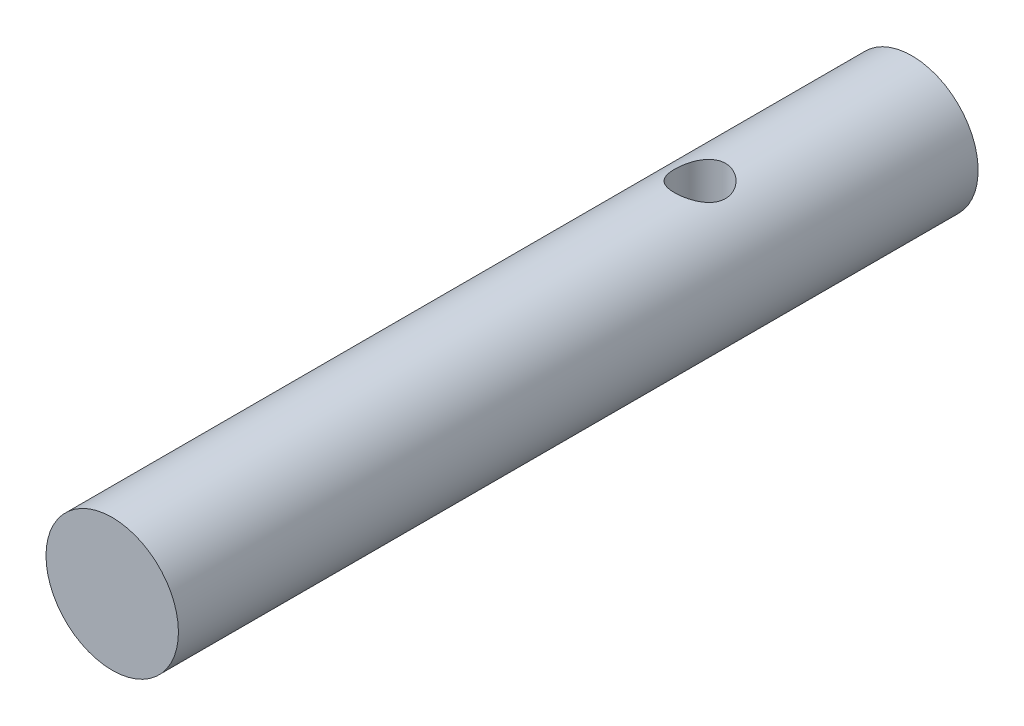
ISO-10303-21;
HEADER;
FILE_DESCRIPTION(('STEP AP214'),'2;1');
FILE_NAME('part.step','',(''),(''),'','','');
FILE_SCHEMA(('AUTOMOTIVE_DESIGN { 1 0 10303 214 1 1 1 1 }'));
ENDSEC;
DATA;
#1=APPLICATION_CONTEXT('core data for automotive mechanical design processes');
#2=APPLICATION_PROTOCOL_DEFINITION('international standard','automotive_design',2000,#1);
#3=PRODUCT_CONTEXT('',#1,'mechanical');
#4=PRODUCT('Part','Part','',(#3));
#5=PRODUCT_RELATED_PRODUCT_CATEGORY('part','',(#4));
#6=PRODUCT_DEFINITION_FORMATION('','',#4);
#7=PRODUCT_DEFINITION_CONTEXT('part definition',#1,'design');
#8=PRODUCT_DEFINITION('design','',#6,#7);
#9=PRODUCT_DEFINITION_SHAPE('','',#8);
#10=(LENGTH_UNIT() NAMED_UNIT(*) SI_UNIT(.MILLI.,.METRE.));
#11=(NAMED_UNIT(*) PLANE_ANGLE_UNIT() SI_UNIT($,.RADIAN.));
#12=(NAMED_UNIT(*) SI_UNIT($,.STERADIAN.) SOLID_ANGLE_UNIT());
#13=UNCERTAINTY_MEASURE_WITH_UNIT(LENGTH_MEASURE(1.E-05),#10,'distance_accuracy_value','');
#14=(GEOMETRIC_REPRESENTATION_CONTEXT(3) GLOBAL_UNCERTAINTY_ASSIGNED_CONTEXT((#13)) GLOBAL_UNIT_ASSIGNED_CONTEXT((#10,
#11,#12)) REPRESENTATION_CONTEXT('',''));
#15=CARTESIAN_POINT('',(0.,0.,0.));
#16=DIRECTION('',(0.,0.,1.));
#17=DIRECTION('',(1.,0.,0.));
#18=AXIS2_PLACEMENT_3D('',#15,#16,#17);
#19=CARTESIAN_POINT('',(49.9999999999997,120.4,173.5));
#20=DIRECTION('',(0.,0.,-1.));
#21=DIRECTION('',(-1.,0.,0.));
#22=AXIS2_PLACEMENT_3D('',#19,#20,#21);
#23=CYLINDRICAL_SURFACE('',#22,6.5);
#24=CARTESIAN_POINT('',(50.,113.9,-150.2));
#25=CARTESIAN_POINT('',(49.8648569360255,113.899995370137,-150.199993927366));
#26=CARTESIAN_POINT('',(49.7297543163098,113.904250781703,-150.210992010332));
#27=CARTESIAN_POINT('',(49.4636001063237,113.920799394986,-150.254504679692));
#28=CARTESIAN_POINT('',(49.3325477106707,113.933090987807,-150.287014959218));
#29=CARTESIAN_POINT('',(49.0783719967748,113.964396706734,-150.372223093158));
#30=CARTESIAN_POINT('',(48.9552334653472,113.983397449006,-150.424880773621));
#31=CARTESIAN_POINT('',(48.7195509109868,114.026240073069,-150.548679086722));
#32=CARTESIAN_POINT('',(48.6070098904103,114.050083320774,-150.619824935867));
#33=CARTESIAN_POINT('',(48.3907274132546,114.101342120172,-150.781869571504));
#34=CARTESIAN_POINT('',(48.287517270289,114.128862346074,-150.873444061664));
#35=CARTESIAN_POINT('',(48.0974862658747,114.183872117362,-151.072312088808));
#36=CARTESIAN_POINT('',(48.0106708066665,114.211361649679,-151.17961078649));
#37=CARTESIAN_POINT('',(47.8524265832136,114.264432533301,-151.412174979189));
#38=CARTESIAN_POINT('',(47.7817633689856,114.289891515449,-151.537992128593));
#39=CARTESIAN_POINT('',(47.6628381082266,114.334380814589,-151.800856659822));
#40=CARTESIAN_POINT('',(47.6145665843167,114.353413850462,-151.937899261474));
#41=CARTESIAN_POINT('',(47.5439173709796,114.381772691875,-152.213196736226));
#42=CARTESIAN_POINT('',(47.5205219879901,114.391478308187,-152.351149953308));
#43=CARTESIAN_POINT('',(47.4971080052481,114.401191051695,-152.629339459977));
#44=CARTESIAN_POINT('',(47.4970790955748,114.401202456239,-152.769574715353));
#45=CARTESIAN_POINT('',(47.5196234368706,114.391851624264,-153.038864258152));
#46=CARTESIAN_POINT('',(47.5407620429355,114.383084370669,-153.168063212915));
#47=CARTESIAN_POINT('',(47.6026619386656,114.358156596172,-153.420915079407));
#48=CARTESIAN_POINT('',(47.6434263425707,114.341994901932,-153.544567107539));
#49=CARTESIAN_POINT('',(47.744173360771,114.303756298309,-153.785658311782));
#50=CARTESIAN_POINT('',(47.8045154952335,114.28157010805,-153.902929152217));
#51=CARTESIAN_POINT('',(47.9424538839718,114.233816323288,-154.126087878502));
#52=CARTESIAN_POINT('',(48.0200563076405,114.208247521055,-154.231971674123));
#53=CARTESIAN_POINT('',(48.1967948466707,114.154396548195,-154.437259161246));
#54=CARTESIAN_POINT('',(48.297068555506,114.126050611602,-154.53566921961));
#55=CARTESIAN_POINT('',(48.5130136095442,114.071393131742,-154.714580669283));
#56=CARTESIAN_POINT('',(48.62868756797,114.045081934944,-154.795079015001));
#57=CARTESIAN_POINT('',(48.8747908924492,113.996885932677,-154.937055048215));
#58=CARTESIAN_POINT('',(49.0054379008434,113.975084093005,-154.998185657593));
#59=CARTESIAN_POINT('',(49.2762103335865,113.93898298564,-155.097266102549));
#60=CARTESIAN_POINT('',(49.4163312860351,113.92468020576,-155.135226791131));
#61=CARTESIAN_POINT('',(49.6937241259577,113.90581476875,-155.184942181762));
#62=CARTESIAN_POINT('',(49.8307228227463,113.900755779516,-155.198033878958));
#63=CARTESIAN_POINT('',(50.1050380560697,113.899402939048,-155.201553438037));
#64=CARTESIAN_POINT('',(50.2423545101173,113.903107023036,-155.191986638772));
#65=CARTESIAN_POINT('',(50.5075233914846,113.91853747347,-155.15146491566));
#66=CARTESIAN_POINT('',(50.6355332786326,113.929929936224,-155.121399693969));
#67=CARTESIAN_POINT('',(50.8845911124195,113.959252047836,-155.041920769499));
#68=CARTESIAN_POINT('',(51.0056381538334,113.977182544477,-154.992504557429));
#69=CARTESIAN_POINT('',(51.2413976272735,114.018488371272,-154.874132384767));
#70=CARTESIAN_POINT('',(51.3558122909773,114.042010519008,-154.804636185622));
#71=CARTESIAN_POINT('',(51.5717472094606,114.091916869993,-154.648682871873));
#72=CARTESIAN_POINT('',(51.6732625124397,114.118302165183,-154.562219276043));
#73=CARTESIAN_POINT('',(51.867008663459,114.173040176701,-154.368580249317));
#74=CARTESIAN_POINT('',(51.9582939990394,114.201414643799,-154.260462461031));
#75=CARTESIAN_POINT('',(52.1216298075656,114.255400121447,-154.029904597358));
#76=CARTESIAN_POINT('',(52.1936780477103,114.281010811008,-153.907462861796));
#77=CARTESIAN_POINT('',(52.3167016588595,114.326513011289,-153.650423952603));
#78=CARTESIAN_POINT('',(52.3675457507259,114.346368667284,-153.515757160765));
#79=CARTESIAN_POINT('',(52.4454786278655,114.377423472433,-153.238789394497));
#80=CARTESIAN_POINT('',(52.4725831636482,114.388628360536,-153.09649354834));
#81=CARTESIAN_POINT('',(52.5008221053295,114.400324973139,-152.818611399132));
#82=CARTESIAN_POINT('',(52.5035796294326,114.401486156865,-152.68321698093));
#83=CARTESIAN_POINT('',(52.4872441285209,114.394694525215,-152.413998907565));
#84=CARTESIAN_POINT('',(52.4681534084365,114.386742671239,-152.280175088212));
#85=CARTESIAN_POINT('',(52.4099513674169,114.36319107724,-152.022503937197));
#86=CARTESIAN_POINT('',(52.3715382839678,114.347858817028,-151.898472297688));
#87=CARTESIAN_POINT('',(52.276411151596,114.311442436843,-151.658550206541));
#88=CARTESIAN_POINT('',(52.2196923673986,114.290356828826,-151.542661870848));
#89=CARTESIAN_POINT('',(52.085993195051,114.243385216856,-151.315464696426));
#90=CARTESIAN_POINT('',(52.0080793942802,114.21730064338,-151.204746758524));
#91=CARTESIAN_POINT('',(51.8356157399033,114.163922938996,-150.997440282091));
#92=CARTESIAN_POINT('',(51.7410604619884,114.136629416208,-150.900856369419));
#93=CARTESIAN_POINT('',(51.5314383021902,114.08200394833,-150.718824624031));
#94=CARTESIAN_POINT('',(51.4154988293532,114.054761919151,-150.63434994106));
#95=CARTESIAN_POINT('',(51.1701071623707,114.004961723837,-150.486089140357));
#96=CARTESIAN_POINT('',(51.0406527047282,113.982404344186,-150.422306495509));
#97=CARTESIAN_POINT('',(50.7629008422325,113.943308605623,-150.314295580981));
#98=CARTESIAN_POINT('',(50.6139250375314,113.927259294457,-150.271615623945));
#99=CARTESIAN_POINT('',(50.3099460978443,113.905610637558,-150.214479395075));
#100=CARTESIAN_POINT('',(50.1549464660004,113.900005308307,-150.200006962497));
#101=CARTESIAN_POINT('',(50.,113.9,-150.2));
#102=B_SPLINE_CURVE_WITH_KNOTS('',3,(#24,#25,#26,#27,#28,#29,#30,#31,#32,#33,#34,#35,#36,#37,
#38,#39,#40,#41,#42,#43,#44,#45,#46,#47,#48,#49,#50,#51,#52,#53,#54,#55,#56,#57,#58,#59,#60,#61,
#62,#63,#64,#65,#66,#67,#68,#69,#70,#71,#72,#73,#74,#75,#76,#77,#78,#79,#80,#81,#82,#83,#84,#85,
#86,#87,#88,#89,#90,#91,#92,#93,#94,#95,#96,#97,#98,#99,#100,#101),.UNSPECIFIED.,.T.,.F.,(4,2,2,
2,2,2,2,2,2,2,2,2,2,2,2,2,2,2,2,2,2,2,2,2,2,2,2,2,2,2,2,2,2,2,2,2,2,2,4),(0.,0.404857395673165,
0.809633761045258,1.21360717298343,1.61769469151933,2.03792903302861,2.45830160597863,
2.8956990771273,3.33291124861785,3.75145366078395,4.1698114006033,4.56161223088487,
4.95347525299,5.35298551114873,5.75263879750163,6.18066348321893,6.60876089197116,
7.04414506400745,7.47932514126758,7.89036278979613,8.30130359821625,8.69545686414669,
9.08966125783838,9.4956566096056,9.90180734683235,10.3327599285419,10.7637625081092,
11.1973952581665,11.6307400870075,12.0349578310579,12.4391329351611,12.8296520191847,
13.2202722028207,13.6321153154032,14.0440929181879,14.4800085178991,14.9159972424678,
15.3804472276237,15.8446310403092),.UNSPECIFIED.);
#103=CARTESIAN_POINT('',(50.,113.9,-150.2));
#104=VERTEX_POINT('',#103);
#105=EDGE_CURVE('E45',#104,#104,#102,.T.);
#106=ORIENTED_EDGE('',*,*,#105,.F.);
#107=EDGE_LOOP('',(#106));
#108=FACE_BOUND('',#107,.T.);
#109=CARTESIAN_POINT('',(50.,126.9,-150.2));
#110=CARTESIAN_POINT('',(50.1351430639745,126.900004629863,-150.199993927366));
#111=CARTESIAN_POINT('',(50.2702456836902,126.895749218297,-150.210992010332));
#112=CARTESIAN_POINT('',(50.5363998936764,126.879200605014,-150.254504679692));
#113=CARTESIAN_POINT('',(50.6674522893293,126.866909012193,-150.287014959218));
#114=CARTESIAN_POINT('',(50.9216280032252,126.835603293266,-150.372223093158));
#115=CARTESIAN_POINT('',(51.0447665346528,126.816602550994,-150.424880773621));
#116=CARTESIAN_POINT('',(51.2804490890132,126.773759926931,-150.548679086722));
#117=CARTESIAN_POINT('',(51.3929901095897,126.749916679226,-150.619824935867));
#118=CARTESIAN_POINT('',(51.6092725867455,126.698657879828,-150.781869571504));
#119=CARTESIAN_POINT('',(51.7124827297111,126.671137653926,-150.873444061664));
#120=CARTESIAN_POINT('',(51.9025137341253,126.616127882637,-151.072312088808));
#121=CARTESIAN_POINT('',(51.9893291933336,126.588638350321,-151.17961078649));
#122=CARTESIAN_POINT('',(52.1475734167864,126.535567466699,-151.412174979189));
#123=CARTESIAN_POINT('',(52.2182366310144,126.510108484551,-151.537992128593));
#124=CARTESIAN_POINT('',(52.3371618917734,126.46561918541,-151.800856659822));
#125=CARTESIAN_POINT('',(52.3854334156833,126.446586149538,-151.937899261474));
#126=CARTESIAN_POINT('',(52.4560826290204,126.418227308125,-152.213196736226));
#127=CARTESIAN_POINT('',(52.4794780120099,126.408521691813,-152.351149953308));
#128=CARTESIAN_POINT('',(52.5028919947519,126.398808948305,-152.629339459977));
#129=CARTESIAN_POINT('',(52.5029209044252,126.398797543761,-152.769574715353));
#130=CARTESIAN_POINT('',(52.4803765631294,126.408148375736,-153.038864258152));
#131=CARTESIAN_POINT('',(52.4592379570645,126.416915629331,-153.168063212915));
#132=CARTESIAN_POINT('',(52.3973380613344,126.441843403828,-153.420915079407));
#133=CARTESIAN_POINT('',(52.3565736574293,126.458005098068,-153.544567107539));
#134=CARTESIAN_POINT('',(52.255826639229,126.496243701691,-153.785658311782));
#135=CARTESIAN_POINT('',(52.1954845047665,126.518429891949,-153.902929152217));
#136=CARTESIAN_POINT('',(52.0575461160282,126.566183676712,-154.126087878502));
#137=CARTESIAN_POINT('',(51.9799436923595,126.591752478945,-154.231971674123));
#138=CARTESIAN_POINT('',(51.8032051533293,126.645603451805,-154.437259161246));
#139=CARTESIAN_POINT('',(51.702931444494,126.673949388398,-154.53566921961));
#140=CARTESIAN_POINT('',(51.4869863904558,126.728606868258,-154.714580669283));
#141=CARTESIAN_POINT('',(51.37131243203,126.754918065056,-154.795079015001));
#142=CARTESIAN_POINT('',(51.1252091075508,126.803114067323,-154.937055048215));
#143=CARTESIAN_POINT('',(50.9945620991566,126.824915906994,-154.998185657593));
#144=CARTESIAN_POINT('',(50.7237896664135,126.86101701436,-155.097266102549));
#145=CARTESIAN_POINT('',(50.583668713965,126.875319794239,-155.135226791131));
#146=CARTESIAN_POINT('',(50.3062758740423,126.89418523125,-155.184942181762));
#147=CARTESIAN_POINT('',(50.1692771772537,126.899244220484,-155.198033878958));
#148=CARTESIAN_POINT('',(49.8949619439303,126.900597060952,-155.201553438037));
#149=CARTESIAN_POINT('',(49.7576454898827,126.896892976964,-155.191986638772));
#150=CARTESIAN_POINT('',(49.4924766085154,126.88146252653,-155.15146491566));
#151=CARTESIAN_POINT('',(49.3644667213674,126.870070063776,-155.121399693969));
#152=CARTESIAN_POINT('',(49.1154088875804,126.840747952164,-155.041920769499));
#153=CARTESIAN_POINT('',(48.9943618461666,126.822817455523,-154.992504557429));
#154=CARTESIAN_POINT('',(48.7586023727265,126.781511628728,-154.874132384767));
#155=CARTESIAN_POINT('',(48.6441877090227,126.757989480992,-154.804636185622));
#156=CARTESIAN_POINT('',(48.4282527905394,126.708083130007,-154.648682871873));
#157=CARTESIAN_POINT('',(48.3267374875602,126.681697834817,-154.562219276043));
#158=CARTESIAN_POINT('',(48.132991336541,126.626959823299,-154.368580249317));
#159=CARTESIAN_POINT('',(48.0417060009606,126.598585356201,-154.260462461031));
#160=CARTESIAN_POINT('',(47.8783701924343,126.544599878553,-154.029904597358));
#161=CARTESIAN_POINT('',(47.8063219522897,126.518989188993,-153.907462861796));
#162=CARTESIAN_POINT('',(47.6832983411405,126.473486988711,-153.650423952603));
#163=CARTESIAN_POINT('',(47.6324542492741,126.453631332716,-153.515757160765));
#164=CARTESIAN_POINT('',(47.5545213721345,126.422576527567,-153.238789394497));
#165=CARTESIAN_POINT('',(47.5274168363518,126.411371639464,-153.09649354834));
#166=CARTESIAN_POINT('',(47.4991778946705,126.399675026861,-152.818611399132));
#167=CARTESIAN_POINT('',(47.4964203705674,126.398513843135,-152.68321698093));
#168=CARTESIAN_POINT('',(47.5127558714792,126.405305474785,-152.413998907565));
#169=CARTESIAN_POINT('',(47.5318465915635,126.413257328761,-152.280175088212));
#170=CARTESIAN_POINT('',(47.5900486325831,126.43680892276,-152.022503937197));
#171=CARTESIAN_POINT('',(47.6284617160322,126.452141182972,-151.898472297688));
#172=CARTESIAN_POINT('',(47.723588848404,126.488557563157,-151.658550206541));
#173=CARTESIAN_POINT('',(47.7803076326014,126.509643171174,-151.542661870848));
#174=CARTESIAN_POINT('',(47.914006804949,126.556614783144,-151.315464696426));
#175=CARTESIAN_POINT('',(47.9919206057199,126.582699356621,-151.204746758524));
#176=CARTESIAN_POINT('',(48.1643842600968,126.636077061004,-150.997440282091));
#177=CARTESIAN_POINT('',(48.2589395380117,126.663370583792,-150.900856369419));
#178=CARTESIAN_POINT('',(48.4685616978099,126.71799605167,-150.718824624031));
#179=CARTESIAN_POINT('',(48.5845011706469,126.745238080849,-150.63434994106));
#180=CARTESIAN_POINT('',(48.8298928376294,126.795038276163,-150.486089140357));
#181=CARTESIAN_POINT('',(48.9593472952718,126.817595655814,-150.422306495509));
#182=CARTESIAN_POINT('',(49.2370991577676,126.856691394377,-150.314295580981));
#183=CARTESIAN_POINT('',(49.3860749624686,126.872740705543,-150.271615623945));
#184=CARTESIAN_POINT('',(49.6900539021558,126.894389362442,-150.214479395075));
#185=CARTESIAN_POINT('',(49.8450535339997,126.899994691693,-150.200006962497));
#186=CARTESIAN_POINT('',(50.,126.9,-150.2));
#187=B_SPLINE_CURVE_WITH_KNOTS('',3,(#109,#110,#111,#112,#113,#114,#115,#116,#117,#118,#119,
#120,#121,#122,#123,#124,#125,#126,#127,#128,#129,#130,#131,#132,#133,#134,#135,#136,#137,#138,
#139,#140,#141,#142,#143,#144,#145,#146,#147,#148,#149,#150,#151,#152,#153,#154,#155,#156,#157,
#158,#159,#160,#161,#162,#163,#164,#165,#166,#167,#168,#169,#170,#171,#172,#173,#174,#175,#176,
#177,#178,#179,#180,#181,#182,#183,#184,#185,#186),.UNSPECIFIED.,.T.,.F.,(4,2,2,2,2,2,2,2,2,2,2,
2,2,2,2,2,2,2,2,2,2,2,2,2,2,2,2,2,2,2,2,2,2,2,2,2,2,2,4),(0.,0.404857395673187,
0.809633761045283,1.21360717298345,1.61769469151939,2.03792903302869,2.45830160597873,
2.89569907712739,3.33291124861794,3.75145366078399,4.16981140060339,4.56161223088494,
4.95347525299004,5.3529855111488,5.75263879750169,6.18066348321899,6.60876089197121,
7.04414506400752,7.47932514126764,7.89036278979621,8.30130359821635,8.69545686414679,
9.08966125783846,9.4956566096057,9.90180734683243,10.332759928542,10.7637625081093,
11.1973952581666,11.6307400870075,12.034957831058,12.4391329351612,12.8296520191848,
13.2202722028208,13.6321153154033,14.044092918188,14.4800085178992,14.9159972424679,
15.3804472276238,15.8446310403092),.UNSPECIFIED.);
#188=CARTESIAN_POINT('',(50.,126.9,-150.2));
#189=VERTEX_POINT('',#188);
#190=EDGE_CURVE('E10',#189,#189,#187,.T.);
#191=ORIENTED_EDGE('',*,*,#190,.F.);
#192=EDGE_LOOP('',(#191));
#193=FACE_BOUND('',#192,.T.);
#194=CARTESIAN_POINT('',(49.9999999999997,120.4,-173.5));
#195=DIRECTION('',(0.,0.,-1.));
#196=DIRECTION('',(-1.,0.,0.));
#197=AXIS2_PLACEMENT_3D('',#194,#195,#196);
#198=CIRCLE('',#197,6.5);
#199=CARTESIAN_POINT('',(43.4999999999997,120.4,-173.5));
#200=VERTEX_POINT('',#199);
#201=EDGE_CURVE('E51',#200,#200,#198,.T.);
#202=ORIENTED_EDGE('',*,*,#201,.F.);
#203=EDGE_LOOP('',(#202));
#204=FACE_BOUND('',#203,.T.);
#205=CARTESIAN_POINT('',(49.9999999999997,120.4,-95.));
#206=DIRECTION('',(0.,0.,1.));
#207=DIRECTION('',(1.,0.,0.));
#208=AXIS2_PLACEMENT_3D('',#205,#206,#207);
#209=CIRCLE('',#208,6.5);
#210=CARTESIAN_POINT('',(56.4999999999997,120.4,-95.));
#211=VERTEX_POINT('',#210);
#212=EDGE_CURVE('E40',#211,#211,#209,.F.);
#213=ORIENTED_EDGE('',*,*,#212,.T.);
#214=EDGE_LOOP('',(#213));
#215=FACE_BOUND('',#214,.T.);
#216=ADVANCED_FACE('F36',(#108,#193,#204,#215),#23,.T.);
#217=CARTESIAN_POINT('',(49.9999999999997,120.4,-173.5));
#218=DIRECTION('',(0.,0.,-1.));
#219=DIRECTION('',(-1.,0.,0.));
#220=AXIS2_PLACEMENT_3D('',#217,#218,#219);
#221=PLANE('',#220);
#222=ORIENTED_EDGE('',*,*,#201,.T.);
#223=EDGE_LOOP('',(#222));
#224=FACE_BOUND('',#223,.T.);
#225=ADVANCED_FACE('F65',(#224),#221,.T.);
#226=CARTESIAN_POINT('',(50.,107.7,-152.7));
#227=DIRECTION('',(0.,1.,0.));
#228=DIRECTION('',(0.,0.,1.));
#229=AXIS2_PLACEMENT_3D('',#226,#227,#228);
#230=CYLINDRICAL_SURFACE('',#229,2.50000000000001);
#231=ORIENTED_EDGE('',*,*,#105,.T.);
#232=EDGE_LOOP('',(#231));
#233=FACE_BOUND('',#232,.T.);
#234=ORIENTED_EDGE('',*,*,#190,.T.);
#235=EDGE_LOOP('',(#234));
#236=FACE_BOUND('',#235,.T.);
#237=ADVANCED_FACE('F60',(#233,#236),#230,.F.);
#238=CARTESIAN_POINT('',(49.9999999999997,120.4,-95.));
#239=DIRECTION('',(0.,0.,1.));
#240=DIRECTION('',(1.,0.,0.));
#241=AXIS2_PLACEMENT_3D('',#238,#239,#240);
#242=PLANE('',#241);
#243=ORIENTED_EDGE('',*,*,#212,.F.);
#244=EDGE_LOOP('',(#243));
#245=FACE_BOUND('',#244,.T.);
#246=ADVANCED_FACE('F64',(#245),#242,.T.);
#247=CLOSED_SHELL('',(#216,#225,#237,#246));
#248=MANIFOLD_SOLID_BREP('B2',#247);
#249=ADVANCED_BREP_SHAPE_REPRESENTATION('',(#18,#248),#14);
#250=SHAPE_DEFINITION_REPRESENTATION(#9,#249);
ENDSEC;
END-ISO-10303-21;
